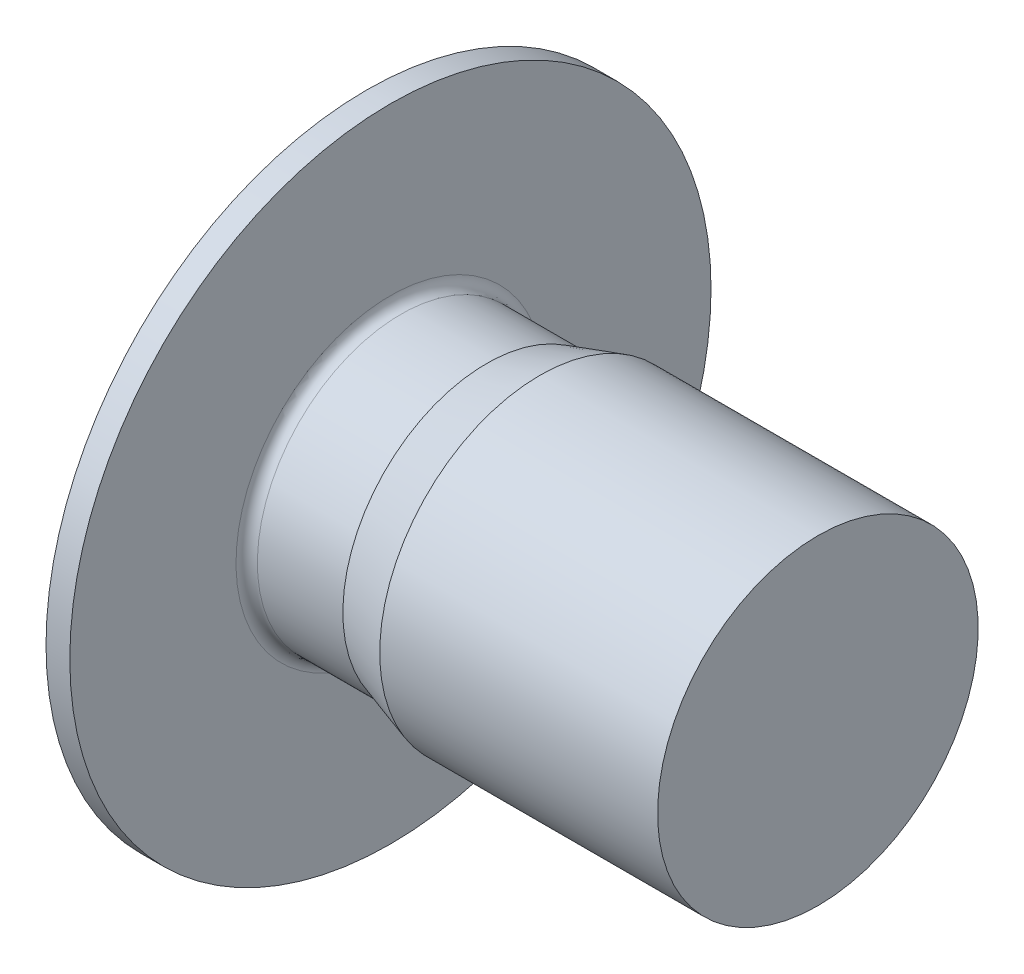
ISO-10303-21;
HEADER;
FILE_DESCRIPTION(('STEP AP214'),'2;1');
FILE_NAME('part.step','',(''),(''),'','','');
FILE_SCHEMA(('AUTOMOTIVE_DESIGN { 1 0 10303 214 1 1 1 1 }'));
ENDSEC;
DATA;
#1=APPLICATION_CONTEXT('core data for automotive mechanical design processes');
#2=APPLICATION_PROTOCOL_DEFINITION('international standard','automotive_design',2000,#1);
#3=PRODUCT_CONTEXT('',#1,'mechanical');
#4=PRODUCT('Part','Part','',(#3));
#5=PRODUCT_RELATED_PRODUCT_CATEGORY('part','',(#4));
#6=PRODUCT_DEFINITION_FORMATION('','',#4);
#7=PRODUCT_DEFINITION_CONTEXT('part definition',#1,'design');
#8=PRODUCT_DEFINITION('design','',#6,#7);
#9=PRODUCT_DEFINITION_SHAPE('','',#8);
#10=(LENGTH_UNIT() NAMED_UNIT(*) SI_UNIT(.MILLI.,.METRE.));
#11=(NAMED_UNIT(*) PLANE_ANGLE_UNIT() SI_UNIT($,.RADIAN.));
#12=(NAMED_UNIT(*) SI_UNIT($,.STERADIAN.) SOLID_ANGLE_UNIT());
#13=UNCERTAINTY_MEASURE_WITH_UNIT(LENGTH_MEASURE(1.E-05),#10,'distance_accuracy_value','');
#14=(GEOMETRIC_REPRESENTATION_CONTEXT(3) GLOBAL_UNCERTAINTY_ASSIGNED_CONTEXT((#13)) GLOBAL_UNIT_ASSIGNED_CONTEXT((#10,
#11,#12)) REPRESENTATION_CONTEXT('',''));
#15=CARTESIAN_POINT('',(0.,0.,0.));
#16=DIRECTION('',(0.,0.,1.));
#17=DIRECTION('',(1.,0.,0.));
#18=AXIS2_PLACEMENT_3D('',#15,#16,#17);
#19=CARTESIAN_POINT('',(1.2,0.,0.));
#20=DIRECTION('',(-1.,0.,0.));
#21=DIRECTION('',(0.,0.,1.));
#22=AXIS2_PLACEMENT_3D('',#19,#20,#21);
#23=PLANE('',#22);
#24=CARTESIAN_POINT('',(1.2,0.,0.));
#25=DIRECTION('',(-1.,0.,0.));
#26=DIRECTION('',(0.,-1.,0.));
#27=AXIS2_PLACEMENT_3D('',#24,#25,#26);
#28=CIRCLE('',#27,0.75);
#29=CARTESIAN_POINT('',(1.2,-0.649519052838329,0.375));
#30=VERTEX_POINT('',#29);
#31=CARTESIAN_POINT('',(1.2,0.,0.75));
#32=VERTEX_POINT('',#31);
#33=EDGE_CURVE('E58',#30,#32,#28,.T.);
#34=ORIENTED_EDGE('',*,*,#33,.F.);
#35=DIRECTION('',(0.,0.5,0.866025403784439));
#36=VECTOR('',#35,1.);
#37=CARTESIAN_POINT('',(1.2,-0.866025403784439,0.));
#38=LINE('',#37,#36);
#39=CARTESIAN_POINT('',(1.2,-0.43301270189222,0.75));
#40=VERTEX_POINT('',#39);
#41=EDGE_CURVE('E309',#30,#40,#38,.T.);
#42=ORIENTED_EDGE('',*,*,#41,.T.);
#43=DIRECTION('',(0.,1.,0.));
#44=VECTOR('',#43,1.);
#45=CARTESIAN_POINT('',(1.2,-0.43301270189222,0.75));
#46=LINE('',#45,#44);
#47=EDGE_CURVE('E261',#40,#32,#46,.T.);
#48=ORIENTED_EDGE('',*,*,#47,.T.);
#49=EDGE_LOOP('',(#34,#42,#48));
#50=FACE_BOUND('',#49,.T.);
#51=ADVANCED_FACE('F46',(#50),#23,.T.);
#52=CARTESIAN_POINT('',(1.2,0.649519052838329,0.375));
#53=VERTEX_POINT('',#52);
#54=EDGE_CURVE('E11',#32,#53,#28,.T.);
#55=ORIENTED_EDGE('',*,*,#54,.F.);
#56=CARTESIAN_POINT('',(1.2,0.43301270189222,0.75));
#57=VERTEX_POINT('',#56);
#58=EDGE_CURVE('E298',#32,#57,#46,.T.);
#59=ORIENTED_EDGE('',*,*,#58,.T.);
#60=DIRECTION('',(0.,0.5,-0.866025403784439));
#61=VECTOR('',#60,1.);
#62=CARTESIAN_POINT('',(1.2,0.43301270189222,0.75));
#63=LINE('',#62,#61);
#64=EDGE_CURVE('E328',#57,#53,#63,.T.);
#65=ORIENTED_EDGE('',*,*,#64,.T.);
#66=EDGE_LOOP('',(#55,#59,#65));
#67=FACE_BOUND('',#66,.T.);
#68=ADVANCED_FACE('F134',(#67),#23,.T.);
#69=CARTESIAN_POINT('',(1.2,0.649519052838329,-0.375));
#70=VERTEX_POINT('',#69);
#71=EDGE_CURVE('E56',#53,#70,#28,.T.);
#72=ORIENTED_EDGE('',*,*,#71,.F.);
#73=CARTESIAN_POINT('',(1.2,0.866025403784439,0.));
#74=VERTEX_POINT('',#73);
#75=EDGE_CURVE('E278',#53,#74,#63,.T.);
#76=ORIENTED_EDGE('',*,*,#75,.T.);
#77=DIRECTION('',(0.,-0.5,-0.866025403784439));
#78=VECTOR('',#77,1.);
#79=CARTESIAN_POINT('',(1.2,0.866025403784439,0.));
#80=LINE('',#79,#78);
#81=EDGE_CURVE('E324',#74,#70,#80,.T.);
#82=ORIENTED_EDGE('',*,*,#81,.T.);
#83=EDGE_LOOP('',(#72,#76,#82));
#84=FACE_BOUND('',#83,.T.);
#85=ADVANCED_FACE('F139',(#84),#23,.T.);
#86=CARTESIAN_POINT('',(1.2,0.,-0.75));
#87=VERTEX_POINT('',#86);
#88=EDGE_CURVE('E247',#70,#87,#28,.T.);
#89=ORIENTED_EDGE('',*,*,#88,.F.);
#90=CARTESIAN_POINT('',(1.2,0.433012701892219,-0.75));
#91=VERTEX_POINT('',#90);
#92=EDGE_CURVE('E327',#70,#91,#80,.T.);
#93=ORIENTED_EDGE('',*,*,#92,.T.);
#94=DIRECTION('',(0.,-1.,0.));
#95=VECTOR('',#94,1.);
#96=CARTESIAN_POINT('',(1.2,0.433012701892219,-0.75));
#97=LINE('',#96,#95);
#98=EDGE_CURVE('E319',#91,#87,#97,.T.);
#99=ORIENTED_EDGE('',*,*,#98,.T.);
#100=EDGE_LOOP('',(#89,#93,#99));
#101=FACE_BOUND('',#100,.T.);
#102=ADVANCED_FACE('F198',(#101),#23,.T.);
#103=CARTESIAN_POINT('',(1.2,-0.649519052838329,-0.375));
#104=VERTEX_POINT('',#103);
#105=EDGE_CURVE('E65',#87,#104,#28,.T.);
#106=ORIENTED_EDGE('',*,*,#105,.F.);
#107=CARTESIAN_POINT('',(1.2,-0.43301270189222,-0.75));
#108=VERTEX_POINT('',#107);
#109=EDGE_CURVE('E323',#87,#108,#97,.T.);
#110=ORIENTED_EDGE('',*,*,#109,.T.);
#111=DIRECTION('',(0.,-0.5,0.866025403784438));
#112=VECTOR('',#111,1.);
#113=CARTESIAN_POINT('',(1.2,-0.43301270189222,-0.75));
#114=LINE('',#113,#112);
#115=EDGE_CURVE('E313',#108,#104,#114,.T.);
#116=ORIENTED_EDGE('',*,*,#115,.T.);
#117=EDGE_LOOP('',(#106,#110,#116));
#118=FACE_BOUND('',#117,.T.);
#119=ADVANCED_FACE('F132',(#118),#23,.T.);
#120=CARTESIAN_POINT('',(-0.8,0.,0.));
#121=DIRECTION('',(-1.,0.,0.));
#122=DIRECTION('',(0.,-1.,0.));
#123=AXIS2_PLACEMENT_3D('',#120,#121,#122);
#124=CYLINDRICAL_SURFACE('',#123,1.345);
#125=CARTESIAN_POINT('',(0.1,0.,0.));
#126=DIRECTION('',(-1.,0.,0.));
#127=DIRECTION('',(0.,-1.,0.));
#128=AXIS2_PLACEMENT_3D('',#125,#126,#127);
#129=CIRCLE('',#128,1.345);
#130=CARTESIAN_POINT('',(0.1,-1.345,0.));
#131=VERTEX_POINT('',#130);
#132=EDGE_CURVE('E50',#131,#131,#129,.F.);
#133=ORIENTED_EDGE('',*,*,#132,.T.);
#134=EDGE_LOOP('',(#133));
#135=FACE_BOUND('',#134,.T.);
#136=CARTESIAN_POINT('',(0.9,0.,0.));
#137=DIRECTION('',(-1.,0.,0.));
#138=DIRECTION('',(0.,-1.,0.));
#139=AXIS2_PLACEMENT_3D('',#136,#137,#138);
#140=CIRCLE('',#139,1.345);
#141=CARTESIAN_POINT('',(0.9,-1.345,0.));
#142=VERTEX_POINT('',#141);
#143=EDGE_CURVE('E205',#142,#142,#140,.T.);
#144=ORIENTED_EDGE('',*,*,#143,.T.);
#145=EDGE_LOOP('',(#144));
#146=FACE_BOUND('',#145,.T.);
#147=ADVANCED_FACE('F191',(#135,#146),#124,.T.);
#148=CARTESIAN_POINT('',(0.,3.,0.));
#149=DIRECTION('',(-1.,0.,0.));
#150=DIRECTION('',(0.,-1.,0.));
#151=AXIS2_PLACEMENT_3D('',#148,#149,#150);
#152=PLANE('',#151);
#153=CARTESIAN_POINT('',(0.,0.,0.));
#154=DIRECTION('',(-1.,0.,0.));
#155=DIRECTION('',(0.,-1.,0.));
#156=AXIS2_PLACEMENT_3D('',#153,#154,#155);
#157=CIRCLE('',#156,1.445);
#158=CARTESIAN_POINT('',(0.,-1.445,0.));
#159=VERTEX_POINT('',#158);
#160=EDGE_CURVE('E236',#159,#159,#157,.T.);
#161=ORIENTED_EDGE('',*,*,#160,.T.);
#162=EDGE_LOOP('',(#161));
#163=FACE_BOUND('',#162,.T.);
#164=CARTESIAN_POINT('',(0.,0.,0.));
#165=DIRECTION('',(-1.,0.,0.));
#166=DIRECTION('',(0.,-1.,0.));
#167=AXIS2_PLACEMENT_3D('',#164,#165,#166);
#168=CIRCLE('',#167,3.);
#169=CARTESIAN_POINT('',(0.,-3.,0.));
#170=VERTEX_POINT('',#169);
#171=EDGE_CURVE('E233',#170,#170,#168,.T.);
#172=ORIENTED_EDGE('',*,*,#171,.F.);
#173=EDGE_LOOP('',(#172));
#174=FACE_BOUND('',#173,.T.);
#175=ADVANCED_FACE('F188',(#163,#174),#152,.F.);
#176=CARTESIAN_POINT('',(-0.8,0.,0.));
#177=DIRECTION('',(-1.,0.,0.));
#178=DIRECTION('',(0.,-1.,0.));
#179=AXIS2_PLACEMENT_3D('',#176,#177,#178);
#180=CYLINDRICAL_SURFACE('',#179,3.);
#181=CARTESIAN_POINT('',(-0.222649730810382,0.,0.));
#182=DIRECTION('',(-1.,0.,0.));
#183=DIRECTION('',(0.,-1.,0.));
#184=AXIS2_PLACEMENT_3D('',#181,#182,#183);
#185=CIRCLE('',#184,3.);
#186=CARTESIAN_POINT('',(-0.222649730810381,-3.,0.));
#187=VERTEX_POINT('',#186);
#188=EDGE_CURVE('E229',#187,#187,#185,.T.);
#189=ORIENTED_EDGE('',*,*,#188,.F.);
#190=EDGE_LOOP('',(#189));
#191=FACE_BOUND('',#190,.T.);
#192=ORIENTED_EDGE('',*,*,#171,.T.);
#193=EDGE_LOOP('',(#192));
#194=FACE_BOUND('',#193,.T.);
#195=ADVANCED_FACE('F184',(#191,#194),#180,.T.);
#196=CARTESIAN_POINT('',(-0.222649730810382,0.,0.));
#197=DIRECTION('',(1.,0.,0.));
#198=DIRECTION('',(0.,1.,0.));
#199=AXIS2_PLACEMENT_3D('',#196,#197,#198);
#200=CONICAL_SURFACE('',#199,3.,1.0471975511966);
#201=CARTESIAN_POINT('',(-0.799999999999999,0.,0.));
#202=DIRECTION('',(-1.,0.,0.));
#203=DIRECTION('',(0.,-1.,0.));
#204=AXIS2_PLACEMENT_3D('',#201,#202,#203);
#205=CIRCLE('',#204,2.);
#206=CARTESIAN_POINT('',(-0.799999999999999,-2.,0.));
#207=VERTEX_POINT('',#206);
#208=EDGE_CURVE('E225',#207,#207,#205,.T.);
#209=ORIENTED_EDGE('',*,*,#208,.F.);
#210=EDGE_LOOP('',(#209));
#211=FACE_BOUND('',#210,.T.);
#212=ORIENTED_EDGE('',*,*,#188,.T.);
#213=EDGE_LOOP('',(#212));
#214=FACE_BOUND('',#213,.T.);
#215=ADVANCED_FACE('F180',(#211,#214),#200,.T.);
#216=CARTESIAN_POINT('',(-0.8,0.,0.));
#217=DIRECTION('',(1.,0.,0.));
#218=DIRECTION('',(0.,1.,0.));
#219=AXIS2_PLACEMENT_3D('',#216,#217,#218);
#220=PLANE('',#219);
#221=DIRECTION('',(0.,-0.5,-0.866025403784439));
#222=VECTOR('',#221,1.);
#223=CARTESIAN_POINT('',(-0.8,0.866025403784439,0.));
#224=LINE('',#223,#222);
#225=CARTESIAN_POINT('',(-0.8,0.866025403784439,0.));
#226=VERTEX_POINT('',#225);
#227=CARTESIAN_POINT('',(-0.8,0.433012701892219,-0.75));
#228=VERTEX_POINT('',#227);
#229=EDGE_CURVE('E253',#226,#228,#224,.T.);
#230=ORIENTED_EDGE('',*,*,#229,.F.);
#231=DIRECTION('',(0.,0.5,-0.866025403784439));
#232=VECTOR('',#231,1.);
#233=CARTESIAN_POINT('',(-0.8,0.43301270189222,0.75));
#234=LINE('',#233,#232);
#235=CARTESIAN_POINT('',(-0.8,0.43301270189222,0.75));
#236=VERTEX_POINT('',#235);
#237=EDGE_CURVE('E73',#236,#226,#234,.T.);
#238=ORIENTED_EDGE('',*,*,#237,.F.);
#239=DIRECTION('',(0.,1.,0.));
#240=VECTOR('',#239,1.);
#241=CARTESIAN_POINT('',(-0.8,-0.43301270189222,0.75));
#242=LINE('',#241,#240);
#243=CARTESIAN_POINT('',(-0.8,-0.43301270189222,0.75));
#244=VERTEX_POINT('',#243);
#245=EDGE_CURVE('E275',#244,#236,#242,.T.);
#246=ORIENTED_EDGE('',*,*,#245,.F.);
#247=DIRECTION('',(0.,0.5,0.866025403784439));
#248=VECTOR('',#247,1.);
#249=CARTESIAN_POINT('',(-0.8,-0.866025403784439,0.));
#250=LINE('',#249,#248);
#251=CARTESIAN_POINT('',(-0.8,-0.866025403784439,0.));
#252=VERTEX_POINT('',#251);
#253=EDGE_CURVE('E271',#252,#244,#250,.T.);
#254=ORIENTED_EDGE('',*,*,#253,.F.);
#255=DIRECTION('',(0.,-0.5,0.866025403784438));
#256=VECTOR('',#255,1.);
#257=CARTESIAN_POINT('',(-0.8,-0.43301270189222,-0.75));
#258=LINE('',#257,#256);
#259=CARTESIAN_POINT('',(-0.8,-0.43301270189222,-0.75));
#260=VERTEX_POINT('',#259);
#261=EDGE_CURVE('E267',#260,#252,#258,.T.);
#262=ORIENTED_EDGE('',*,*,#261,.F.);
#263=DIRECTION('',(0.,-1.,0.));
#264=VECTOR('',#263,1.);
#265=CARTESIAN_POINT('',(-0.8,0.433012701892219,-0.75));
#266=LINE('',#265,#264);
#267=EDGE_CURVE('E258',#228,#260,#266,.T.);
#268=ORIENTED_EDGE('',*,*,#267,.F.);
#269=EDGE_LOOP('',(#230,#238,#246,#254,#262,#268));
#270=FACE_BOUND('',#269,.T.);
#271=ORIENTED_EDGE('',*,*,#208,.T.);
#272=EDGE_LOOP('',(#271));
#273=FACE_BOUND('',#272,.T.);
#274=ADVANCED_FACE('F176',(#270,#273),#220,.F.);
#275=CARTESIAN_POINT('',(4.,1.5,0.));
#276=DIRECTION('',(-1.,0.,0.));
#277=DIRECTION('',(0.,-1.,0.));
#278=AXIS2_PLACEMENT_3D('',#275,#276,#277);
#279=PLANE('',#278);
#280=CARTESIAN_POINT('',(4.,0.,0.));
#281=DIRECTION('',(-1.,0.,0.));
#282=DIRECTION('',(0.,-1.,0.));
#283=AXIS2_PLACEMENT_3D('',#280,#281,#282);
#284=CIRCLE('',#283,1.5);
#285=CARTESIAN_POINT('',(4.,-1.5,0.));
#286=VERTEX_POINT('',#285);
#287=EDGE_CURVE('E214',#286,#286,#284,.T.);
#288=ORIENTED_EDGE('',*,*,#287,.F.);
#289=EDGE_LOOP('',(#288));
#290=FACE_BOUND('',#289,.T.);
#291=ADVANCED_FACE('F172',(#290),#279,.F.);
#292=CARTESIAN_POINT('',(-0.8,0.,0.));
#293=DIRECTION('',(-1.,0.,0.));
#294=DIRECTION('',(0.,-1.,0.));
#295=AXIS2_PLACEMENT_3D('',#292,#293,#294);
#296=CYLINDRICAL_SURFACE('',#295,1.5);
#297=CARTESIAN_POINT('',(1.4,0.,0.));
#298=DIRECTION('',(-1.,0.,0.));
#299=DIRECTION('',(0.,-1.,0.));
#300=AXIS2_PLACEMENT_3D('',#297,#298,#299);
#301=CIRCLE('',#300,1.5);
#302=CARTESIAN_POINT('',(1.4,-1.5,0.));
#303=VERTEX_POINT('',#302);
#304=EDGE_CURVE('E207',#303,#303,#301,.T.);
#305=ORIENTED_EDGE('',*,*,#304,.F.);
#306=EDGE_LOOP('',(#305));
#307=FACE_BOUND('',#306,.T.);
#308=ORIENTED_EDGE('',*,*,#287,.T.);
#309=EDGE_LOOP('',(#308));
#310=FACE_BOUND('',#309,.T.);
#311=ADVANCED_FACE('F168',(#307,#310),#296,.T.);
#312=CARTESIAN_POINT('',(1.4,0.,0.));
#313=DIRECTION('',(1.,0.,0.));
#314=DIRECTION('',(0.,1.,0.));
#315=AXIS2_PLACEMENT_3D('',#312,#313,#314);
#316=CONICAL_SURFACE('',#315,1.5,0.300605670042395);
#317=ORIENTED_EDGE('',*,*,#143,.F.);
#318=EDGE_LOOP('',(#317));
#319=FACE_BOUND('',#318,.T.);
#320=ORIENTED_EDGE('',*,*,#304,.T.);
#321=EDGE_LOOP('',(#320));
#322=FACE_BOUND('',#321,.T.);
#323=ADVANCED_FACE('F165',(#319,#322),#316,.T.);
#324=CARTESIAN_POINT('',(0.1,0.,0.));
#325=DIRECTION('',(-1.,0.,0.));
#326=DIRECTION('',(0.,-1.,0.));
#327=AXIS2_PLACEMENT_3D('',#324,#325,#326);
#328=TOROIDAL_SURFACE('',#327,1.445,0.1);
#329=ORIENTED_EDGE('',*,*,#132,.F.);
#330=EDGE_LOOP('',(#329));
#331=FACE_BOUND('',#330,.T.);
#332=ORIENTED_EDGE('',*,*,#160,.F.);
#333=EDGE_LOOP('',(#332));
#334=FACE_BOUND('',#333,.T.);
#335=ADVANCED_FACE('F48',(#331,#334),#328,.F.);
#336=CARTESIAN_POINT('',(1.2,0.43301270189222,0.75));
#337=DIRECTION('',(0.,0.866025403784439,0.5));
#338=DIRECTION('',(0.,-0.5,0.866025403784439));
#339=AXIS2_PLACEMENT_3D('',#336,#337,#338);
#340=PLANE('',#339);
#341=ORIENTED_EDGE('',*,*,#237,.T.);
#342=DIRECTION('',(-1.,0.,0.));
#343=VECTOR('',#342,1.);
#344=CARTESIAN_POINT('',(1.2,0.866025403784439,0.));
#345=LINE('',#344,#343);
#346=EDGE_CURVE('E219',#74,#226,#345,.T.);
#347=ORIENTED_EDGE('',*,*,#346,.F.);
#348=ORIENTED_EDGE('',*,*,#75,.F.);
#349=ORIENTED_EDGE('',*,*,#64,.F.);
#350=DIRECTION('',(-1.,0.,0.));
#351=VECTOR('',#350,1.);
#352=CARTESIAN_POINT('',(1.2,0.43301270189222,0.75));
#353=LINE('',#352,#351);
#354=EDGE_CURVE('E208',#57,#236,#353,.T.);
#355=ORIENTED_EDGE('',*,*,#354,.T.);
#356=EDGE_LOOP('',(#341,#347,#348,#349,#355));
#357=FACE_BOUND('',#356,.T.);
#358=ADVANCED_FACE('F147',(#357),#340,.F.);
#359=CARTESIAN_POINT('',(1.2,-0.43301270189222,0.75));
#360=DIRECTION('',(0.,0.,1.));
#361=DIRECTION('',(0.,-1.,0.));
#362=AXIS2_PLACEMENT_3D('',#359,#360,#361);
#363=PLANE('',#362);
#364=ORIENTED_EDGE('',*,*,#245,.T.);
#365=ORIENTED_EDGE('',*,*,#354,.F.);
#366=ORIENTED_EDGE('',*,*,#58,.F.);
#367=ORIENTED_EDGE('',*,*,#47,.F.);
#368=DIRECTION('',(-1.,0.,0.));
#369=VECTOR('',#368,1.);
#370=CARTESIAN_POINT('',(1.2,-0.43301270189222,0.75));
#371=LINE('',#370,#369);
#372=EDGE_CURVE('E216',#40,#244,#371,.T.);
#373=ORIENTED_EDGE('',*,*,#372,.T.);
#374=EDGE_LOOP('',(#364,#365,#366,#367,#373));
#375=FACE_BOUND('',#374,.T.);
#376=ADVANCED_FACE('F143',(#375),#363,.F.);
#377=CARTESIAN_POINT('',(1.2,-0.866025403784439,0.));
#378=DIRECTION('',(0.,-0.866025403784439,0.5));
#379=DIRECTION('',(0.,-0.5,-0.866025403784439));
#380=AXIS2_PLACEMENT_3D('',#377,#378,#379);
#381=PLANE('',#380);
#382=ORIENTED_EDGE('',*,*,#253,.T.);
#383=ORIENTED_EDGE('',*,*,#372,.F.);
#384=ORIENTED_EDGE('',*,*,#41,.F.);
#385=CARTESIAN_POINT('',(1.2,-0.866025403784439,0.));
#386=VERTEX_POINT('',#385);
#387=EDGE_CURVE('E302',#386,#30,#38,.T.);
#388=ORIENTED_EDGE('',*,*,#387,.F.);
#389=DIRECTION('',(-1.,0.,0.));
#390=VECTOR('',#389,1.);
#391=CARTESIAN_POINT('',(1.2,-0.866025403784439,0.));
#392=LINE('',#391,#390);
#393=EDGE_CURVE('E282',#386,#252,#392,.T.);
#394=ORIENTED_EDGE('',*,*,#393,.T.);
#395=EDGE_LOOP('',(#382,#383,#384,#388,#394));
#396=FACE_BOUND('',#395,.T.);
#397=ADVANCED_FACE('F146',(#396),#381,.F.);
#398=CARTESIAN_POINT('',(1.2,-0.43301270189222,-0.75));
#399=DIRECTION('',(0.,-0.866025403784438,-0.5));
#400=DIRECTION('',(0.,0.5,-0.866025403784439));
#401=AXIS2_PLACEMENT_3D('',#398,#399,#400);
#402=PLANE('',#401);
#403=ORIENTED_EDGE('',*,*,#261,.T.);
#404=ORIENTED_EDGE('',*,*,#393,.F.);
#405=EDGE_CURVE('E318',#104,#386,#114,.T.);
#406=ORIENTED_EDGE('',*,*,#405,.F.);
#407=ORIENTED_EDGE('',*,*,#115,.F.);
#408=DIRECTION('',(-1.,0.,0.));
#409=VECTOR('',#408,1.);
#410=CARTESIAN_POINT('',(1.2,-0.43301270189222,-0.75));
#411=LINE('',#410,#409);
#412=EDGE_CURVE('E285',#108,#260,#411,.T.);
#413=ORIENTED_EDGE('',*,*,#412,.T.);
#414=EDGE_LOOP('',(#403,#404,#406,#407,#413));
#415=FACE_BOUND('',#414,.T.);
#416=ADVANCED_FACE('F151',(#415),#402,.F.);
#417=CARTESIAN_POINT('',(1.2,0.433012701892219,-0.75));
#418=DIRECTION('',(0.,0.,-1.));
#419=DIRECTION('',(-1.,0.,0.));
#420=AXIS2_PLACEMENT_3D('',#417,#418,#419);
#421=PLANE('',#420);
#422=ORIENTED_EDGE('',*,*,#267,.T.);
#423=ORIENTED_EDGE('',*,*,#412,.F.);
#424=ORIENTED_EDGE('',*,*,#109,.F.);
#425=ORIENTED_EDGE('',*,*,#98,.F.);
#426=DIRECTION('',(-1.,0.,0.));
#427=VECTOR('',#426,1.);
#428=CARTESIAN_POINT('',(1.2,0.433012701892219,-0.75));
#429=LINE('',#428,#427);
#430=EDGE_CURVE('E287',#91,#228,#429,.T.);
#431=ORIENTED_EDGE('',*,*,#430,.T.);
#432=EDGE_LOOP('',(#422,#423,#424,#425,#431));
#433=FACE_BOUND('',#432,.T.);
#434=ADVANCED_FACE('F155',(#433),#421,.F.);
#435=CARTESIAN_POINT('',(1.2,0.866025403784439,0.));
#436=DIRECTION('',(0.,0.866025403784439,-0.5));
#437=DIRECTION('',(0.,0.5,0.866025403784439));
#438=AXIS2_PLACEMENT_3D('',#435,#436,#437);
#439=PLANE('',#438);
#440=ORIENTED_EDGE('',*,*,#229,.T.);
#441=ORIENTED_EDGE('',*,*,#430,.F.);
#442=ORIENTED_EDGE('',*,*,#92,.F.);
#443=ORIENTED_EDGE('',*,*,#81,.F.);
#444=ORIENTED_EDGE('',*,*,#346,.T.);
#445=EDGE_LOOP('',(#440,#441,#442,#443,#444));
#446=FACE_BOUND('',#445,.T.);
#447=ADVANCED_FACE('F129',(#446),#439,.F.);
#448=EDGE_CURVE('E242',#104,#30,#28,.T.);
#449=ORIENTED_EDGE('',*,*,#448,.F.);
#450=ORIENTED_EDGE('',*,*,#405,.T.);
#451=ORIENTED_EDGE('',*,*,#387,.T.);
#452=EDGE_LOOP('',(#449,#450,#451));
#453=FACE_BOUND('',#452,.T.);
#454=ADVANCED_FACE('F124',(#453),#23,.T.);
#455=CARTESIAN_POINT('',(1.65064546427067,0.,0.));
#456=DIRECTION('',(-1.,0.,0.));
#457=DIRECTION('',(0.,-1.,0.));
#458=AXIS2_PLACEMENT_3D('',#455,#456,#457);
#459=CONICAL_SURFACE('',#458,0.,1.02974425867666);
#460=ORIENTED_EDGE('',*,*,#33,.T.);
#461=ORIENTED_EDGE('',*,*,#54,.T.);
#462=ORIENTED_EDGE('',*,*,#71,.T.);
#463=ORIENTED_EDGE('',*,*,#88,.T.);
#464=ORIENTED_EDGE('',*,*,#105,.T.);
#465=ORIENTED_EDGE('',*,*,#448,.T.);
#466=EDGE_LOOP('',(#460,#461,#462,#463,#464,#465));
#467=FACE_BOUND('',#466,.T.);
#468=CARTESIAN_POINT('',(1.65064546427067,0.,0.));
#469=VERTEX_POINT('',#468);
#470=VERTEX_LOOP('',#469);
#471=FACE_BOUND('',#470,.T.);
#472=ADVANCED_FACE('F122',(#467,#471),#459,.F.);
#473=CLOSED_SHELL('',(#51,#68,#85,#102,#119,#147,#175,#195,#215,#274,#291,#311,#323,#335,#358,
#376,#397,#416,#434,#447,#454,#472));
#474=MANIFOLD_SOLID_BREP('B2',#473);
#475=ADVANCED_BREP_SHAPE_REPRESENTATION('',(#18,#474),#14);
#476=SHAPE_DEFINITION_REPRESENTATION(#9,#475);
ENDSEC;
END-ISO-10303-21;
